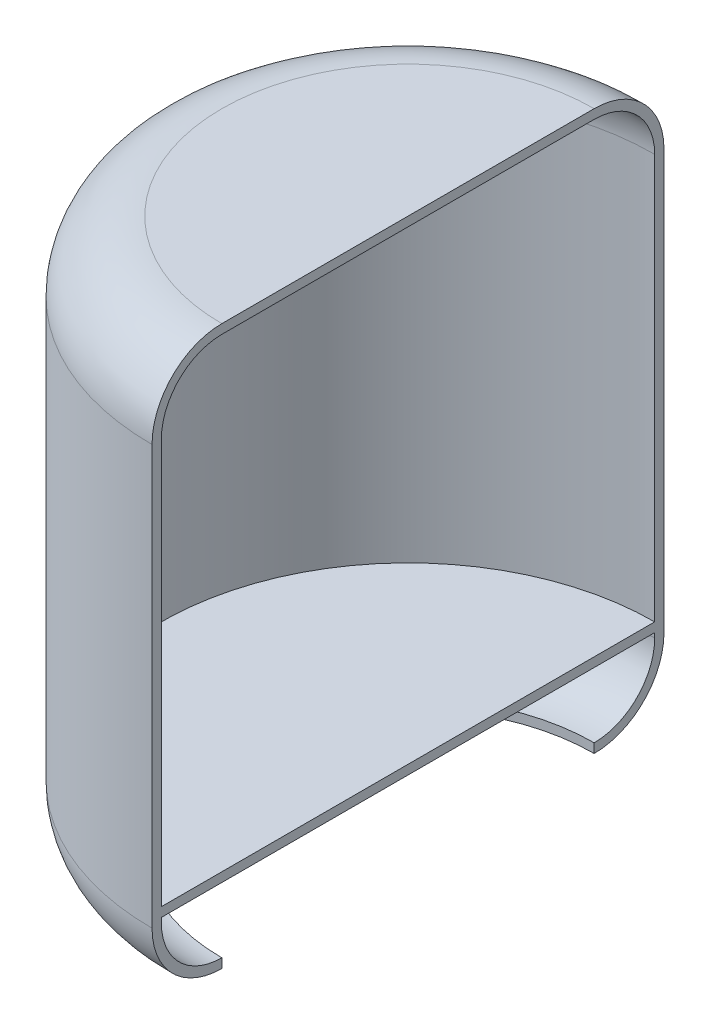
ISO-10303-21;
HEADER;
FILE_DESCRIPTION(('STEP AP214'),'2;1');
FILE_NAME('part.step','',(''),(''),'','','');
FILE_SCHEMA(('AUTOMOTIVE_DESIGN { 1 0 10303 214 1 1 1 1 }'));
ENDSEC;
DATA;
#1=APPLICATION_CONTEXT('core data for automotive mechanical design processes');
#2=APPLICATION_PROTOCOL_DEFINITION('international standard','automotive_design',2000,#1);
#3=PRODUCT_CONTEXT('',#1,'mechanical');
#4=PRODUCT('Part','Part','',(#3));
#5=PRODUCT_RELATED_PRODUCT_CATEGORY('part','',(#4));
#6=PRODUCT_DEFINITION_FORMATION('','',#4);
#7=PRODUCT_DEFINITION_CONTEXT('part definition',#1,'design');
#8=PRODUCT_DEFINITION('design','',#6,#7);
#9=PRODUCT_DEFINITION_SHAPE('','',#8);
#10=(LENGTH_UNIT() NAMED_UNIT(*) SI_UNIT(.MILLI.,.METRE.));
#11=(NAMED_UNIT(*) PLANE_ANGLE_UNIT() SI_UNIT($,.RADIAN.));
#12=(NAMED_UNIT(*) SI_UNIT($,.STERADIAN.) SOLID_ANGLE_UNIT());
#13=UNCERTAINTY_MEASURE_WITH_UNIT(LENGTH_MEASURE(1.E-05),#10,'distance_accuracy_value','');
#14=(GEOMETRIC_REPRESENTATION_CONTEXT(3) GLOBAL_UNCERTAINTY_ASSIGNED_CONTEXT((#13)) GLOBAL_UNIT_ASSIGNED_CONTEXT((#10,
#11,#12)) REPRESENTATION_CONTEXT('',''));
#15=CARTESIAN_POINT('',(0.,0.,0.));
#16=DIRECTION('',(0.,0.,1.));
#17=DIRECTION('',(1.,0.,0.));
#18=AXIS2_PLACEMENT_3D('',#15,#16,#17);
#19=CARTESIAN_POINT('',(1100.,1388.01094476767,-1100.));
#20=DIRECTION('',(-1.,0.,0.));
#21=DIRECTION('',(0.,-1.,0.));
#22=AXIS2_PLACEMENT_3D('',#19,#20,#21);
#23=PLANE('',#22);
#24=CARTESIAN_POINT('',(1100.,-900.,-800.));
#25=DIRECTION('',(-1.,0.,0.));
#26=DIRECTION('',(0.,0.,1.));
#27=AXIS2_PLACEMENT_3D('',#24,#25,#26);
#28=CIRCLE('',#27,300.);
#29=CARTESIAN_POINT('',(1100.,-900.,-1100.));
#30=VERTEX_POINT('',#29);
#31=CARTESIAN_POINT('',(1100.,-1200.,-800.));
#32=VERTEX_POINT('',#31);
#33=EDGE_CURVE('E165',#30,#32,#28,.T.);
#34=ORIENTED_EDGE('',*,*,#33,.F.);
#35=DIRECTION('',(0.,1.,0.));
#36=VECTOR('',#35,1.);
#37=CARTESIAN_POINT('',(1100.,-1200.,-1100.));
#38=LINE('',#37,#36);
#39=CARTESIAN_POINT('',(1100.,900.,-1100.));
#40=VERTEX_POINT('',#39);
#41=EDGE_CURVE('E166',#30,#40,#38,.T.);
#42=ORIENTED_EDGE('',*,*,#41,.T.);
#43=CARTESIAN_POINT('',(1100.,900.,-800.));
#44=DIRECTION('',(-1.,0.,0.));
#45=DIRECTION('',(0.,0.,1.));
#46=AXIS2_PLACEMENT_3D('',#43,#44,#45);
#47=CIRCLE('',#46,300.);
#48=CARTESIAN_POINT('',(1100.,1200.,-800.));
#49=VERTEX_POINT('',#48);
#50=EDGE_CURVE('E144',#49,#40,#47,.T.);
#51=ORIENTED_EDGE('',*,*,#50,.F.);
#52=DIRECTION('',(0.,0.,-1.));
#53=VECTOR('',#52,1.);
#54=CARTESIAN_POINT('',(1100.,1200.,1100.));
#55=LINE('',#54,#53);
#56=CARTESIAN_POINT('',(1100.,1200.,800.));
#57=VERTEX_POINT('',#56);
#58=EDGE_CURVE('E42',#57,#49,#55,.T.);
#59=ORIENTED_EDGE('',*,*,#58,.F.);
#60=CARTESIAN_POINT('',(1100.,900.,800.));
#61=DIRECTION('',(1.,0.,0.));
#62=DIRECTION('',(0.,0.,-1.));
#63=AXIS2_PLACEMENT_3D('',#60,#61,#62);
#64=CIRCLE('',#63,300.);
#65=CARTESIAN_POINT('',(1100.,900.,1100.));
#66=VERTEX_POINT('',#65);
#67=EDGE_CURVE('E147',#57,#66,#64,.T.);
#68=ORIENTED_EDGE('',*,*,#67,.T.);
#69=DIRECTION('',(0.,1.,0.));
#70=VECTOR('',#69,1.);
#71=CARTESIAN_POINT('',(1100.,-1200.,1100.));
#72=LINE('',#71,#70);
#73=CARTESIAN_POINT('',(1100.,-900.,1100.));
#74=VERTEX_POINT('',#73);
#75=EDGE_CURVE('E162',#74,#66,#72,.T.);
#76=ORIENTED_EDGE('',*,*,#75,.F.);
#77=CARTESIAN_POINT('',(1100.,-900.,800.));
#78=DIRECTION('',(1.,0.,0.));
#79=DIRECTION('',(0.,0.,-1.));
#80=AXIS2_PLACEMENT_3D('',#77,#78,#79);
#81=CIRCLE('',#80,300.);
#82=CARTESIAN_POINT('',(1100.,-1200.,800.));
#83=VERTEX_POINT('',#82);
#84=EDGE_CURVE('E170',#74,#83,#81,.T.);
#85=ORIENTED_EDGE('',*,*,#84,.T.);
#86=DIRECTION('',(0.,-1.,0.));
#87=VECTOR('',#86,1.);
#88=CARTESIAN_POINT('',(1100.,-1200.,800.));
#89=LINE('',#88,#87);
#90=CARTESIAN_POINT('',(1100.,-1160.,800.));
#91=VERTEX_POINT('',#90);
#92=EDGE_CURVE('E142',#91,#83,#89,.T.);
#93=ORIENTED_EDGE('',*,*,#92,.F.);
#94=CARTESIAN_POINT('',(1100.,-900.,800.));
#95=DIRECTION('',(-1.,0.,0.));
#96=DIRECTION('',(0.,0.,1.));
#97=AXIS2_PLACEMENT_3D('',#94,#95,#96);
#98=CIRCLE('',#97,260.);
#99=CARTESIAN_POINT('',(1100.,-900.,1060.));
#100=VERTEX_POINT('',#99);
#101=EDGE_CURVE('E155',#100,#91,#98,.F.);
#102=ORIENTED_EDGE('',*,*,#101,.F.);
#103=DIRECTION('',(0.,1.,0.));
#104=VECTOR('',#103,1.);
#105=CARTESIAN_POINT('',(1100.,-1200.,1060.));
#106=LINE('',#105,#104);
#107=CARTESIAN_POINT('',(1100.,-880.,1060.));
#108=VERTEX_POINT('',#107);
#109=EDGE_CURVE('E133',#100,#108,#106,.T.);
#110=ORIENTED_EDGE('',*,*,#109,.T.);
#111=DIRECTION('',(0.,0.,-1.));
#112=VECTOR('',#111,1.);
#113=CARTESIAN_POINT('',(1100.,-880.,-1060.));
#114=LINE('',#113,#112);
#115=CARTESIAN_POINT('',(1100.,-880.,-1060.));
#116=VERTEX_POINT('',#115);
#117=EDGE_CURVE('E54',#108,#116,#114,.T.);
#118=ORIENTED_EDGE('',*,*,#117,.T.);
#119=DIRECTION('',(0.,-1.,0.));
#120=VECTOR('',#119,1.);
#121=CARTESIAN_POINT('',(1100.,1200.,-1060.));
#122=LINE('',#121,#120);
#123=CARTESIAN_POINT('',(1100.,-900.,-1060.));
#124=VERTEX_POINT('',#123);
#125=EDGE_CURVE('E120',#124,#116,#122,.F.);
#126=ORIENTED_EDGE('',*,*,#125,.F.);
#127=CARTESIAN_POINT('',(1100.,-900.,-800.));
#128=DIRECTION('',(1.,0.,0.));
#129=DIRECTION('',(0.,0.,-1.));
#130=AXIS2_PLACEMENT_3D('',#127,#128,#129);
#131=CIRCLE('',#130,260.);
#132=CARTESIAN_POINT('',(1100.,-1160.,-800.));
#133=VERTEX_POINT('',#132);
#134=EDGE_CURVE('E47',#124,#133,#131,.F.);
#135=ORIENTED_EDGE('',*,*,#134,.T.);
#136=DIRECTION('',(0.,-1.,0.));
#137=VECTOR('',#136,1.);
#138=CARTESIAN_POINT('',(1100.,-1200.,-800.));
#139=LINE('',#138,#137);
#140=EDGE_CURVE('E146',#133,#32,#139,.T.);
#141=ORIENTED_EDGE('',*,*,#140,.T.);
#142=EDGE_LOOP('',(#34,#42,#51,#59,#68,#76,#85,#93,#102,#110,#118,#126,#135,#141));
#143=FACE_BOUND('',#142,.T.);
#144=CARTESIAN_POINT('',(1100.,-840.,-1060.));
#145=VERTEX_POINT('',#144);
#146=CARTESIAN_POINT('',(1100.,900.,-1060.));
#147=VERTEX_POINT('',#146);
#148=EDGE_CURVE('E128',#145,#147,#122,.F.);
#149=ORIENTED_EDGE('',*,*,#148,.F.);
#150=DIRECTION('',(0.,0.,1.));
#151=VECTOR('',#150,1.);
#152=CARTESIAN_POINT('',(1100.,-840.,-1060.));
#153=LINE('',#152,#151);
#154=CARTESIAN_POINT('',(1100.,-840.,1060.));
#155=VERTEX_POINT('',#154);
#156=EDGE_CURVE('E171',#145,#155,#153,.T.);
#157=ORIENTED_EDGE('',*,*,#156,.T.);
#158=CARTESIAN_POINT('',(1100.,900.,1060.));
#159=VERTEX_POINT('',#158);
#160=EDGE_CURVE('E62',#155,#159,#106,.T.);
#161=ORIENTED_EDGE('',*,*,#160,.T.);
#162=CARTESIAN_POINT('',(1100.,900.,800.));
#163=DIRECTION('',(-1.,0.,0.));
#164=DIRECTION('',(0.,0.,1.));
#165=AXIS2_PLACEMENT_3D('',#162,#163,#164);
#166=CIRCLE('',#165,260.);
#167=CARTESIAN_POINT('',(1100.,1160.,800.));
#168=VERTEX_POINT('',#167);
#169=EDGE_CURVE('E139',#168,#159,#166,.F.);
#170=ORIENTED_EDGE('',*,*,#169,.F.);
#171=DIRECTION('',(0.,0.,-1.));
#172=VECTOR('',#171,1.);
#173=CARTESIAN_POINT('',(1100.,1160.,1100.));
#174=LINE('',#173,#172);
#175=CARTESIAN_POINT('',(1100.,1160.,-800.));
#176=VERTEX_POINT('',#175);
#177=EDGE_CURVE('E134',#168,#176,#174,.T.);
#178=ORIENTED_EDGE('',*,*,#177,.T.);
#179=CARTESIAN_POINT('',(1100.,900.,-800.));
#180=DIRECTION('',(-1.,0.,0.));
#181=DIRECTION('',(0.,0.,1.));
#182=AXIS2_PLACEMENT_3D('',#179,#180,#181);
#183=CIRCLE('',#182,260.);
#184=EDGE_CURVE('E11',#176,#147,#183,.T.);
#185=ORIENTED_EDGE('',*,*,#184,.T.);
#186=EDGE_LOOP('',(#149,#157,#161,#170,#178,#185));
#187=FACE_BOUND('',#186,.T.);
#188=ADVANCED_FACE('F39',(#143,#187),#23,.F.);
#189=CARTESIAN_POINT('',(9000.,1160.,1100.));
#190=DIRECTION('',(0.,-1.,0.));
#191=DIRECTION('',(0.,0.,-1.));
#192=AXIS2_PLACEMENT_3D('',#189,#190,#191);
#193=PLANE('',#192);
#194=ORIENTED_EDGE('',*,*,#177,.F.);
#195=CARTESIAN_POINT('',(1100.,1160.,0.));
#196=DIRECTION('',(0.,-1.,0.));
#197=DIRECTION('',(0.,0.,-1.));
#198=AXIS2_PLACEMENT_3D('',#195,#196,#197);
#199=CIRCLE('',#198,800.);
#200=EDGE_CURVE('E150',#176,#168,#199,.F.);
#201=ORIENTED_EDGE('',*,*,#200,.F.);
#202=EDGE_LOOP('',(#194,#201));
#203=FACE_BOUND('',#202,.T.);
#204=ADVANCED_FACE('F197',(#203),#193,.T.);
#205=CARTESIAN_POINT('',(-0.00199999999983547,-840.,-1060.));
#206=DIRECTION('',(0.,1.,0.));
#207=DIRECTION('',(0.,0.,1.));
#208=AXIS2_PLACEMENT_3D('',#205,#206,#207);
#209=PLANE('',#208);
#210=ORIENTED_EDGE('',*,*,#156,.F.);
#211=CARTESIAN_POINT('',(1100.,-840.,0.));
#212=DIRECTION('',(0.,1.,0.));
#213=DIRECTION('',(0.,0.,1.));
#214=AXIS2_PLACEMENT_3D('',#211,#212,#213);
#215=CIRCLE('',#214,1060.);
#216=EDGE_CURVE('E136',#145,#155,#215,.T.);
#217=ORIENTED_EDGE('',*,*,#216,.T.);
#218=EDGE_LOOP('',(#210,#217));
#219=FACE_BOUND('',#218,.T.);
#220=ADVANCED_FACE('F202',(#219),#209,.T.);
#221=CARTESIAN_POINT('',(1100.,900.,0.));
#222=DIRECTION('',(0.,-1.,0.));
#223=DIRECTION('',(0.,0.,-1.));
#224=AXIS2_PLACEMENT_3D('',#221,#222,#223);
#225=TOROIDAL_SURFACE('',#224,800.,260.);
#226=ORIENTED_EDGE('',*,*,#184,.F.);
#227=ORIENTED_EDGE('',*,*,#200,.T.);
#228=ORIENTED_EDGE('',*,*,#169,.T.);
#229=CARTESIAN_POINT('',(1100.,900.,0.));
#230=DIRECTION('',(0.,1.,0.));
#231=DIRECTION('',(0.,0.,1.));
#232=AXIS2_PLACEMENT_3D('',#229,#230,#231);
#233=CIRCLE('',#232,1060.);
#234=EDGE_CURVE('E127',#159,#147,#233,.F.);
#235=ORIENTED_EDGE('',*,*,#234,.T.);
#236=EDGE_LOOP('',(#226,#227,#228,#235));
#237=FACE_BOUND('',#236,.T.);
#238=ADVANCED_FACE('F199',(#237),#225,.F.);
#239=CARTESIAN_POINT('',(1100.,-1200.,0.));
#240=DIRECTION('',(0.,1.,0.));
#241=DIRECTION('',(0.,0.,1.));
#242=AXIS2_PLACEMENT_3D('',#239,#240,#241);
#243=CYLINDRICAL_SURFACE('',#242,1060.);
#244=ORIENTED_EDGE('',*,*,#160,.F.);
#245=ORIENTED_EDGE('',*,*,#216,.F.);
#246=ORIENTED_EDGE('',*,*,#148,.T.);
#247=ORIENTED_EDGE('',*,*,#234,.F.);
#248=EDGE_LOOP('',(#244,#245,#246,#247));
#249=FACE_BOUND('',#248,.T.);
#250=ADVANCED_FACE('F200',(#249),#243,.F.);
#251=CARTESIAN_POINT('',(9000.,1200.,1100.));
#252=DIRECTION('',(0.,-1.,0.));
#253=DIRECTION('',(0.,0.,-1.));
#254=AXIS2_PLACEMENT_3D('',#251,#252,#253);
#255=PLANE('',#254);
#256=CARTESIAN_POINT('',(1100.,1200.,0.));
#257=DIRECTION('',(0.,-1.,0.));
#258=DIRECTION('',(0.,0.,-1.));
#259=AXIS2_PLACEMENT_3D('',#256,#257,#258);
#260=CIRCLE('',#259,800.);
#261=EDGE_CURVE('E180',#49,#57,#260,.F.);
#262=ORIENTED_EDGE('',*,*,#261,.T.);
#263=ORIENTED_EDGE('',*,*,#58,.T.);
#264=EDGE_LOOP('',(#262,#263));
#265=FACE_BOUND('',#264,.T.);
#266=ADVANCED_FACE('F233',(#265),#255,.F.);
#267=CARTESIAN_POINT('',(-0.00199999999983547,-880.,-1060.));
#268=DIRECTION('',(0.,-1.,0.));
#269=DIRECTION('',(0.,0.,-1.));
#270=AXIS2_PLACEMENT_3D('',#267,#268,#269);
#271=PLANE('',#270);
#272=ORIENTED_EDGE('',*,*,#117,.F.);
#273=CARTESIAN_POINT('',(1100.,-880.,0.));
#274=DIRECTION('',(0.,-1.,0.));
#275=DIRECTION('',(0.,0.,-1.));
#276=AXIS2_PLACEMENT_3D('',#273,#274,#275);
#277=CIRCLE('',#276,1060.);
#278=EDGE_CURVE('E122',#108,#116,#277,.T.);
#279=ORIENTED_EDGE('',*,*,#278,.T.);
#280=EDGE_LOOP('',(#272,#279));
#281=FACE_BOUND('',#280,.T.);
#282=ADVANCED_FACE('F135',(#281),#271,.T.);
#283=ORIENTED_EDGE('',*,*,#125,.T.);
#284=ORIENTED_EDGE('',*,*,#278,.F.);
#285=ORIENTED_EDGE('',*,*,#109,.F.);
#286=CARTESIAN_POINT('',(1100.,-900.,0.));
#287=DIRECTION('',(0.,1.,0.));
#288=DIRECTION('',(0.,0.,1.));
#289=AXIS2_PLACEMENT_3D('',#286,#287,#288);
#290=CIRCLE('',#289,1060.);
#291=EDGE_CURVE('E124',#124,#100,#290,.T.);
#292=ORIENTED_EDGE('',*,*,#291,.F.);
#293=EDGE_LOOP('',(#283,#284,#285,#292));
#294=FACE_BOUND('',#293,.T.);
#295=ADVANCED_FACE('F121',(#294),#243,.F.);
#296=CARTESIAN_POINT('',(1100.,-1200.,0.));
#297=DIRECTION('',(0.,1.,0.));
#298=DIRECTION('',(0.,0.,1.));
#299=AXIS2_PLACEMENT_3D('',#296,#297,#298);
#300=CYLINDRICAL_SURFACE('',#299,1100.);
#301=ORIENTED_EDGE('',*,*,#41,.F.);
#302=CARTESIAN_POINT('',(1100.,-900.,0.));
#303=DIRECTION('',(0.,1.,0.));
#304=DIRECTION('',(0.,0.,1.));
#305=AXIS2_PLACEMENT_3D('',#302,#303,#304);
#306=CIRCLE('',#305,1100.);
#307=EDGE_CURVE('E177',#30,#74,#306,.T.);
#308=ORIENTED_EDGE('',*,*,#307,.T.);
#309=ORIENTED_EDGE('',*,*,#75,.T.);
#310=CARTESIAN_POINT('',(1100.,900.,0.));
#311=DIRECTION('',(0.,-1.,0.));
#312=DIRECTION('',(0.,0.,-1.));
#313=AXIS2_PLACEMENT_3D('',#310,#311,#312);
#314=CIRCLE('',#313,1100.);
#315=EDGE_CURVE('E174',#66,#40,#314,.T.);
#316=ORIENTED_EDGE('',*,*,#315,.T.);
#317=EDGE_LOOP('',(#301,#308,#309,#316));
#318=FACE_BOUND('',#317,.T.);
#319=ADVANCED_FACE('F228',(#318),#300,.T.);
#320=CARTESIAN_POINT('',(1100.,-900.,0.));
#321=DIRECTION('',(0.,1.,0.));
#322=DIRECTION('',(0.,0.,1.));
#323=AXIS2_PLACEMENT_3D('',#320,#321,#322);
#324=TOROIDAL_SURFACE('',#323,800.,300.);
#325=ORIENTED_EDGE('',*,*,#33,.T.);
#326=CARTESIAN_POINT('',(1100.,-1200.,0.));
#327=DIRECTION('',(0.,1.,0.));
#328=DIRECTION('',(0.,0.,1.));
#329=AXIS2_PLACEMENT_3D('',#326,#327,#328);
#330=CIRCLE('',#329,800.);
#331=EDGE_CURVE('E164',#83,#32,#330,.F.);
#332=ORIENTED_EDGE('',*,*,#331,.F.);
#333=ORIENTED_EDGE('',*,*,#84,.F.);
#334=ORIENTED_EDGE('',*,*,#307,.F.);
#335=EDGE_LOOP('',(#325,#332,#333,#334));
#336=FACE_BOUND('',#335,.T.);
#337=ADVANCED_FACE('F231',(#336),#324,.T.);
#338=CARTESIAN_POINT('',(1100.,900.,0.));
#339=DIRECTION('',(0.,-1.,0.));
#340=DIRECTION('',(0.,0.,-1.));
#341=AXIS2_PLACEMENT_3D('',#338,#339,#340);
#342=TOROIDAL_SURFACE('',#341,800.,300.);
#343=ORIENTED_EDGE('',*,*,#50,.T.);
#344=ORIENTED_EDGE('',*,*,#315,.F.);
#345=ORIENTED_EDGE('',*,*,#67,.F.);
#346=ORIENTED_EDGE('',*,*,#261,.F.);
#347=EDGE_LOOP('',(#343,#344,#345,#346));
#348=FACE_BOUND('',#347,.T.);
#349=ADVANCED_FACE('F223',(#348),#342,.T.);
#350=CARTESIAN_POINT('',(1100.,-1200.,0.));
#351=DIRECTION('',(0.,1.,0.));
#352=DIRECTION('',(0.,0.,1.));
#353=AXIS2_PLACEMENT_3D('',#350,#351,#352);
#354=CYLINDRICAL_SURFACE('',#353,800.);
#355=ORIENTED_EDGE('',*,*,#331,.T.);
#356=ORIENTED_EDGE('',*,*,#140,.F.);
#357=CARTESIAN_POINT('',(1100.,-1160.,0.));
#358=DIRECTION('',(0.,1.,0.));
#359=DIRECTION('',(0.,0.,1.));
#360=AXIS2_PLACEMENT_3D('',#357,#358,#359);
#361=CIRCLE('',#360,800.);
#362=EDGE_CURVE('E145',#91,#133,#361,.F.);
#363=ORIENTED_EDGE('',*,*,#362,.F.);
#364=ORIENTED_EDGE('',*,*,#92,.T.);
#365=EDGE_LOOP('',(#355,#356,#363,#364));
#366=FACE_BOUND('',#365,.T.);
#367=ADVANCED_FACE('F217',(#366),#354,.F.);
#368=CARTESIAN_POINT('',(1100.,-900.,0.));
#369=DIRECTION('',(0.,1.,0.));
#370=DIRECTION('',(0.,0.,1.));
#371=AXIS2_PLACEMENT_3D('',#368,#369,#370);
#372=TOROIDAL_SURFACE('',#371,800.,260.);
#373=ORIENTED_EDGE('',*,*,#134,.F.);
#374=ORIENTED_EDGE('',*,*,#291,.T.);
#375=ORIENTED_EDGE('',*,*,#101,.T.);
#376=ORIENTED_EDGE('',*,*,#362,.T.);
#377=EDGE_LOOP('',(#373,#374,#375,#376));
#378=FACE_BOUND('',#377,.T.);
#379=ADVANCED_FACE('F213',(#378),#372,.F.);
#380=CLOSED_SHELL('',(#188,#204,#220,#238,#250,#266,#282,#295,#319,#337,#349,#367,#379));
#381=MANIFOLD_SOLID_BREP('B2',#380);
#382=ADVANCED_BREP_SHAPE_REPRESENTATION('',(#18,#381),#14);
#383=SHAPE_DEFINITION_REPRESENTATION(#9,#382);
ENDSEC;
END-ISO-10303-21;
